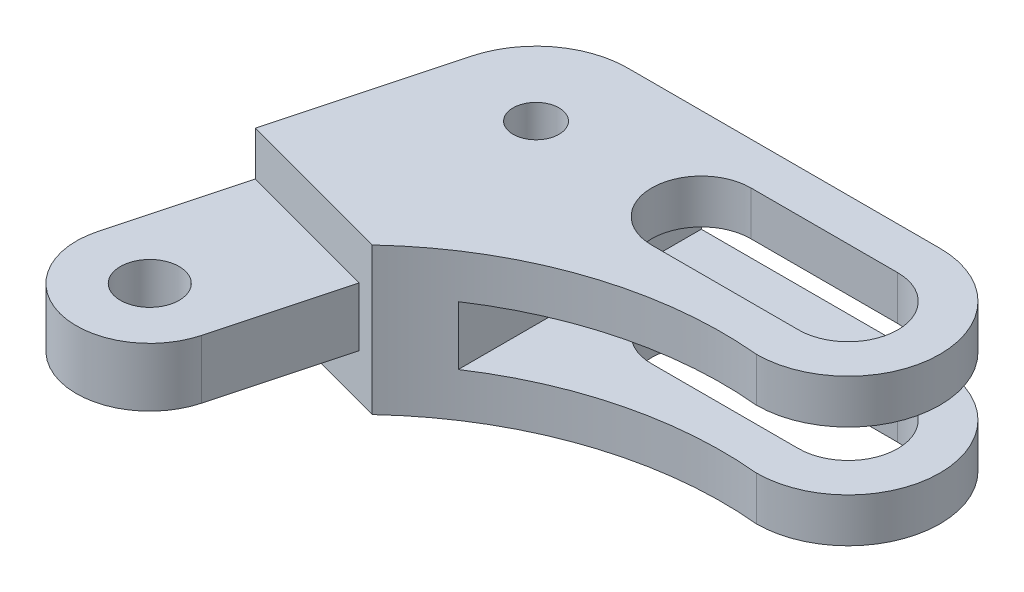
ISO-10303-21;
HEADER;
FILE_DESCRIPTION(('STEP AP214'),'2;1');
FILE_NAME('part.step','',(''),(''),'','','');
FILE_SCHEMA(('AUTOMOTIVE_DESIGN { 1 0 10303 214 1 1 1 1 }'));
ENDSEC;
DATA;
#1=APPLICATION_CONTEXT('core data for automotive mechanical design processes');
#2=APPLICATION_PROTOCOL_DEFINITION('international standard','automotive_design',2000,#1);
#3=PRODUCT_CONTEXT('',#1,'mechanical');
#4=PRODUCT('Part','Part','',(#3));
#5=PRODUCT_RELATED_PRODUCT_CATEGORY('part','',(#4));
#6=PRODUCT_DEFINITION_FORMATION('','',#4);
#7=PRODUCT_DEFINITION_CONTEXT('part definition',#1,'design');
#8=PRODUCT_DEFINITION('design','',#6,#7);
#9=PRODUCT_DEFINITION_SHAPE('','',#8);
#10=(LENGTH_UNIT() NAMED_UNIT(*) SI_UNIT(.MILLI.,.METRE.));
#11=(NAMED_UNIT(*) PLANE_ANGLE_UNIT() SI_UNIT($,.RADIAN.));
#12=(NAMED_UNIT(*) SI_UNIT($,.STERADIAN.) SOLID_ANGLE_UNIT());
#13=UNCERTAINTY_MEASURE_WITH_UNIT(LENGTH_MEASURE(1.E-05),#10,'distance_accuracy_value','');
#14=(GEOMETRIC_REPRESENTATION_CONTEXT(3) GLOBAL_UNCERTAINTY_ASSIGNED_CONTEXT((#13)) GLOBAL_UNIT_ASSIGNED_CONTEXT((#10,
#11,#12)) REPRESENTATION_CONTEXT('',''));
#15=CARTESIAN_POINT('',(0.,0.,0.));
#16=DIRECTION('',(0.,0.,1.));
#17=DIRECTION('',(1.,0.,0.));
#18=AXIS2_PLACEMENT_3D('',#15,#16,#17);
#19=CARTESIAN_POINT('',(224.877356199071,-28.,59.6900004852365));
#20=DIRECTION('',(0.,-1.,0.));
#21=DIRECTION('',(0.,0.,-1.));
#22=AXIS2_PLACEMENT_3D('',#19,#20,#21);
#23=PLANE('',#22);
#24=DIRECTION('',(0.,0.,-1.));
#25=VECTOR('',#24,1.);
#26=CARTESIAN_POINT('',(187.083853502132,-28.,97.4828239634885));
#27=LINE('',#26,#25);
#28=CARTESIAN_POINT('',(187.083853502132,-28.,97.4828239634885));
#29=VERTEX_POINT('',#28);
#30=CARTESIAN_POINT('',(187.083853502132,-28.,31.3048049703411));
#31=VERTEX_POINT('',#30);
#32=EDGE_CURVE('E163',#29,#31,#27,.T.);
#33=ORIENTED_EDGE('',*,*,#32,.F.);
#34=CARTESIAN_POINT('',(242.341419027115,-28.,180.829098338845));
#35=DIRECTION('',(0.,1.,0.));
#36=DIRECTION('',(0.0974243447501531,0.,-0.995242933685039));
#37=AXIS2_PLACEMENT_3D('',#34,#35,#36);
#38=CIRCLE('',#37,100.);
#39=CARTESIAN_POINT('',(252.083853502131,-28.,81.304804970341));
#40=VERTEX_POINT('',#39);
#41=EDGE_CURVE('E160',#40,#29,#38,.T.);
#42=ORIENTED_EDGE('',*,*,#41,.F.);
#43=CARTESIAN_POINT('',(252.083853502131,-28.,56.3048049703411));
#44=DIRECTION('',(0.,-1.,0.));
#45=DIRECTION('',(0.,0.,-1.));
#46=AXIS2_PLACEMENT_3D('',#43,#44,#45);
#47=CIRCLE('',#46,25.);
#48=CARTESIAN_POINT('',(252.083853502132,-28.,31.3048049703411));
#49=VERTEX_POINT('',#48);
#50=EDGE_CURVE('E145',#49,#40,#47,.T.);
#51=ORIENTED_EDGE('',*,*,#50,.F.);
#52=DIRECTION('',(1.,0.,0.));
#53=VECTOR('',#52,1.);
#54=CARTESIAN_POINT('',(187.083853502132,-28.,31.3048049703411));
#55=LINE('',#54,#53);
#56=EDGE_CURVE('E24',#31,#49,#55,.T.);
#57=ORIENTED_EDGE('',*,*,#56,.F.);
#58=EDGE_LOOP('',(#33,#42,#51,#57));
#59=FACE_BOUND('',#58,.T.);
#60=DIRECTION('',(1.,0.,0.));
#61=VECTOR('',#60,1.);
#62=CARTESIAN_POINT('',(212.083853502132,-28.,69.8048049703412));
#63=LINE('',#62,#61);
#64=CARTESIAN_POINT('',(212.083853502132,-28.,69.8048049703412));
#65=VERTEX_POINT('',#64);
#66=CARTESIAN_POINT('',(252.083853502132,-28.,69.8048049703412));
#67=VERTEX_POINT('',#66);
#68=EDGE_CURVE('E169',#65,#67,#63,.T.);
#69=ORIENTED_EDGE('',*,*,#68,.F.);
#70=CARTESIAN_POINT('',(212.083853502132,-28.,56.3048049703412));
#71=DIRECTION('',(0.,1.,0.));
#72=DIRECTION('',(0.,0.,-1.));
#73=AXIS2_PLACEMENT_3D('',#70,#71,#72);
#74=CIRCLE('',#73,13.5);
#75=CARTESIAN_POINT('',(212.083853502132,-28.,42.8048049703412));
#76=VERTEX_POINT('',#75);
#77=EDGE_CURVE('E176',#76,#65,#74,.T.);
#78=ORIENTED_EDGE('',*,*,#77,.F.);
#79=DIRECTION('',(-1.,0.,0.));
#80=VECTOR('',#79,1.);
#81=CARTESIAN_POINT('',(252.083853502132,-28.,42.8048049703412));
#82=LINE('',#81,#80);
#83=CARTESIAN_POINT('',(252.083853502132,-28.,42.8048049703412));
#84=VERTEX_POINT('',#83);
#85=EDGE_CURVE('E190',#84,#76,#82,.T.);
#86=ORIENTED_EDGE('',*,*,#85,.F.);
#87=CARTESIAN_POINT('',(252.083853502132,-28.,56.3048049703412));
#88=DIRECTION('',(0.,1.,0.));
#89=DIRECTION('',(0.,0.,1.));
#90=AXIS2_PLACEMENT_3D('',#87,#88,#89);
#91=CIRCLE('',#90,13.5);
#92=EDGE_CURVE('E192',#67,#84,#91,.T.);
#93=ORIENTED_EDGE('',*,*,#92,.F.);
#94=EDGE_LOOP('',(#69,#78,#86,#93));
#95=FACE_BOUND('',#94,.T.);
#96=ADVANCED_FACE('F15',(#59,#95),#23,.F.);
#97=CARTESIAN_POINT('',(224.877356199071,-40.,59.6900004852365));
#98=DIRECTION('',(0.,-1.,0.));
#99=DIRECTION('',(0.,0.,-1.));
#100=AXIS2_PLACEMENT_3D('',#97,#98,#99);
#101=PLANE('',#100);
#102=DIRECTION('',(1.,0.,0.));
#103=VECTOR('',#102,1.);
#104=CARTESIAN_POINT('',(167.083853502132,-40.,31.3048049703411));
#105=LINE('',#104,#103);
#106=CARTESIAN_POINT('',(167.083853502132,-40.,31.3048049703411));
#107=VERTEX_POINT('',#106);
#108=CARTESIAN_POINT('',(252.083853502132,-40.,31.3048049703411));
#109=VERTEX_POINT('',#108);
#110=EDGE_CURVE('E9',#107,#109,#105,.T.);
#111=ORIENTED_EDGE('',*,*,#110,.T.);
#112=CARTESIAN_POINT('',(252.083853502131,-40.,56.3048049703411));
#113=DIRECTION('',(0.,-1.,0.));
#114=DIRECTION('',(0.,0.,-1.));
#115=AXIS2_PLACEMENT_3D('',#112,#113,#114);
#116=CIRCLE('',#115,25.);
#117=CARTESIAN_POINT('',(252.083853502131,-40.,81.304804970341));
#118=VERTEX_POINT('',#117);
#119=EDGE_CURVE('E153',#109,#118,#116,.T.);
#120=ORIENTED_EDGE('',*,*,#119,.T.);
#121=CARTESIAN_POINT('',(242.341419027115,-40.,180.829098338845));
#122=DIRECTION('',(0.,1.,0.));
#123=DIRECTION('',(0.0974243447501531,0.,-0.995242933685039));
#124=AXIS2_PLACEMENT_3D('',#121,#122,#123);
#125=CIRCLE('',#124,100.);
#126=CARTESIAN_POINT('',(173.979055862993,-40.,107.845625534267));
#127=VERTEX_POINT('',#126);
#128=EDGE_CURVE('E159',#118,#127,#125,.T.);
#129=ORIENTED_EDGE('',*,*,#128,.T.);
#130=DIRECTION('',(-0.965925826289068,0.,-0.258819045102521));
#131=VECTOR('',#130,1.);
#132=CARTESIAN_POINT('',(173.979055862993,-40.,107.845625534267));
#133=LINE('',#132,#131);
#134=CARTESIAN_POINT('',(130.512393679984,-40.,96.1987685046534));
#135=VERTEX_POINT('',#134);
#136=EDGE_CURVE('E256',#127,#135,#133,.T.);
#137=ORIENTED_EDGE('',*,*,#136,.T.);
#138=DIRECTION('',(0.258819045102521,0.,-0.965925826289068));
#139=VECTOR('',#138,1.);
#140=CARTESIAN_POINT('',(130.512393679984,-40.,96.1987685046534));
#141=LINE('',#140,#139);
#142=CARTESIAN_POINT('',(142.935707844905,-40.,49.8343288427781));
#143=VERTEX_POINT('',#142);
#144=EDGE_CURVE('E330',#135,#143,#141,.T.);
#145=ORIENTED_EDGE('',*,*,#144,.T.);
#146=CARTESIAN_POINT('',(167.083853502132,-40.,56.3048049703412));
#147=DIRECTION('',(0.,-1.,0.));
#148=DIRECTION('',(-0.965925826289068,0.,-0.258819045102521));
#149=AXIS2_PLACEMENT_3D('',#146,#147,#148);
#150=CIRCLE('',#149,25.);
#151=EDGE_CURVE('E321',#143,#107,#150,.T.);
#152=ORIENTED_EDGE('',*,*,#151,.T.);
#153=EDGE_LOOP('',(#111,#120,#129,#137,#145,#152));
#154=FACE_BOUND('',#153,.T.);
#155=DIRECTION('',(1.,0.,0.));
#156=VECTOR('',#155,1.);
#157=CARTESIAN_POINT('',(212.083853502132,-40.,69.8048049703412));
#158=LINE('',#157,#156);
#159=CARTESIAN_POINT('',(212.083853502132,-40.,69.8048049703412));
#160=VERTEX_POINT('',#159);
#161=CARTESIAN_POINT('',(252.083853502132,-40.,69.8048049703412));
#162=VERTEX_POINT('',#161);
#163=EDGE_CURVE('E140',#160,#162,#158,.T.);
#164=ORIENTED_EDGE('',*,*,#163,.T.);
#165=CARTESIAN_POINT('',(252.083853502132,-40.,56.3048049703412));
#166=DIRECTION('',(0.,1.,0.));
#167=DIRECTION('',(0.,0.,1.));
#168=AXIS2_PLACEMENT_3D('',#165,#166,#167);
#169=CIRCLE('',#168,13.5);
#170=CARTESIAN_POINT('',(252.083853502132,-40.,42.8048049703412));
#171=VERTEX_POINT('',#170);
#172=EDGE_CURVE('E198',#162,#171,#169,.T.);
#173=ORIENTED_EDGE('',*,*,#172,.T.);
#174=DIRECTION('',(-1.,0.,0.));
#175=VECTOR('',#174,1.);
#176=CARTESIAN_POINT('',(252.083853502132,-40.,42.8048049703412));
#177=LINE('',#176,#175);
#178=CARTESIAN_POINT('',(212.083853502132,-40.,42.8048049703412));
#179=VERTEX_POINT('',#178);
#180=EDGE_CURVE('E188',#171,#179,#177,.T.);
#181=ORIENTED_EDGE('',*,*,#180,.T.);
#182=CARTESIAN_POINT('',(212.083853502132,-40.,56.3048049703412));
#183=DIRECTION('',(0.,1.,0.));
#184=DIRECTION('',(0.,0.,-1.));
#185=AXIS2_PLACEMENT_3D('',#182,#183,#184);
#186=CIRCLE('',#185,13.5);
#187=EDGE_CURVE('E181',#179,#160,#186,.T.);
#188=ORIENTED_EDGE('',*,*,#187,.T.);
#189=EDGE_LOOP('',(#164,#173,#181,#188));
#190=FACE_BOUND('',#189,.T.);
#191=CARTESIAN_POINT('',(167.083853502132,-40.,56.3048049703412));
#192=DIRECTION('',(0.,1.,0.));
#193=DIRECTION('',(1.,0.,0.));
#194=AXIS2_PLACEMENT_3D('',#191,#192,#193);
#195=CIRCLE('',#194,6.25);
#196=CARTESIAN_POINT('',(160.833853502132,-40.,56.3048049703412));
#197=VERTEX_POINT('',#196);
#198=EDGE_CURVE('E250',#197,#197,#195,.T.);
#199=ORIENTED_EDGE('',*,*,#198,.T.);
#200=EDGE_LOOP('',(#199));
#201=FACE_BOUND('',#200,.T.);
#202=ADVANCED_FACE('F345',(#154,#190,#201),#101,.T.);
#203=CARTESIAN_POINT('',(187.083853502132,-28.,31.3048049703411));
#204=DIRECTION('',(0.,0.,-1.));
#205=DIRECTION('',(1.,0.,0.));
#206=AXIS2_PLACEMENT_3D('',#203,#204,#205);
#207=PLANE('',#206);
#208=ORIENTED_EDGE('',*,*,#56,.T.);
#209=DIRECTION('',(0.,-1.,0.));
#210=VECTOR('',#209,1.);
#211=CARTESIAN_POINT('',(252.083853502132,-28.,31.3048049703411));
#212=LINE('',#211,#210);
#213=EDGE_CURVE('E18',#49,#109,#212,.T.);
#214=ORIENTED_EDGE('',*,*,#213,.T.);
#215=ORIENTED_EDGE('',*,*,#110,.F.);
#216=DIRECTION('',(0.,-1.,0.));
#217=VECTOR('',#216,1.);
#218=CARTESIAN_POINT('',(167.083853502132,0.,31.3048049703411));
#219=LINE('',#218,#217);
#220=CARTESIAN_POINT('',(167.083853502132,0.,31.3048049703411));
#221=VERTEX_POINT('',#220);
#222=EDGE_CURVE('E318',#221,#107,#219,.T.);
#223=ORIENTED_EDGE('',*,*,#222,.F.);
#224=DIRECTION('',(1.,0.,0.));
#225=VECTOR('',#224,1.);
#226=CARTESIAN_POINT('',(167.083853502132,0.,31.3048049703411));
#227=LINE('',#226,#225);
#228=CARTESIAN_POINT('',(252.083853502132,0.,31.3048049703411));
#229=VERTEX_POINT('',#228);
#230=EDGE_CURVE('E173',#221,#229,#227,.T.);
#231=ORIENTED_EDGE('',*,*,#230,.T.);
#232=DIRECTION('',(0.,-1.,0.));
#233=VECTOR('',#232,1.);
#234=CARTESIAN_POINT('',(252.083853502132,0.,31.3048049703411));
#235=LINE('',#234,#233);
#236=CARTESIAN_POINT('',(252.083853502132,-12.,31.3048049703411));
#237=VERTEX_POINT('',#236);
#238=EDGE_CURVE('E230',#229,#237,#235,.T.);
#239=ORIENTED_EDGE('',*,*,#238,.T.);
#240=DIRECTION('',(1.,0.,0.));
#241=VECTOR('',#240,1.);
#242=CARTESIAN_POINT('',(187.083853502132,-12.,31.3048049703411));
#243=LINE('',#242,#241);
#244=CARTESIAN_POINT('',(187.083853502132,-12.,31.3048049703411));
#245=VERTEX_POINT('',#244);
#246=EDGE_CURVE('E306',#245,#237,#243,.T.);
#247=ORIENTED_EDGE('',*,*,#246,.F.);
#248=DIRECTION('',(0.,-1.,0.));
#249=VECTOR('',#248,1.);
#250=CARTESIAN_POINT('',(187.083853502132,0.,31.3048049703411));
#251=LINE('',#250,#249);
#252=EDGE_CURVE('E221',#245,#31,#251,.T.);
#253=ORIENTED_EDGE('',*,*,#252,.T.);
#254=EDGE_LOOP('',(#208,#214,#215,#223,#231,#239,#247,#253));
#255=FACE_BOUND('',#254,.T.);
#256=ADVANCED_FACE('F342',(#255),#207,.T.);
#257=CARTESIAN_POINT('',(252.083853502131,-28.,56.3048049703411));
#258=DIRECTION('',(0.,1.,0.));
#259=DIRECTION('',(0.,0.,-1.));
#260=AXIS2_PLACEMENT_3D('',#257,#258,#259);
#261=CYLINDRICAL_SURFACE('',#260,25.);
#262=ORIENTED_EDGE('',*,*,#50,.T.);
#263=DIRECTION('',(0.,-1.,0.));
#264=VECTOR('',#263,1.);
#265=CARTESIAN_POINT('',(252.083853502131,-28.,81.304804970341));
#266=LINE('',#265,#264);
#267=EDGE_CURVE('E146',#40,#118,#266,.T.);
#268=ORIENTED_EDGE('',*,*,#267,.T.);
#269=ORIENTED_EDGE('',*,*,#119,.F.);
#270=ORIENTED_EDGE('',*,*,#213,.F.);
#271=EDGE_LOOP('',(#262,#268,#269,#270));
#272=FACE_BOUND('',#271,.T.);
#273=ADVANCED_FACE('F148',(#272),#261,.T.);
#274=CARTESIAN_POINT('',(242.341419027115,-28.,180.829098338845));
#275=DIRECTION('',(0.,1.,0.));
#276=DIRECTION('',(0.0974243447501531,0.,-0.995242933685039));
#277=AXIS2_PLACEMENT_3D('',#274,#275,#276);
#278=CYLINDRICAL_SURFACE('',#277,100.);
#279=ORIENTED_EDGE('',*,*,#41,.T.);
#280=DIRECTION('',(0.,-1.,0.));
#281=VECTOR('',#280,1.);
#282=CARTESIAN_POINT('',(187.083853502132,0.,97.4828239634884));
#283=LINE('',#282,#281);
#284=CARTESIAN_POINT('',(187.083853502132,-12.,97.4828239634884));
#285=VERTEX_POINT('',#284);
#286=EDGE_CURVE('E223',#285,#29,#283,.T.);
#287=ORIENTED_EDGE('',*,*,#286,.F.);
#288=CARTESIAN_POINT('',(242.341419027115,-12.,180.829098338845));
#289=DIRECTION('',(0.,1.,0.));
#290=DIRECTION('',(0.0974243447501531,0.,-0.995242933685039));
#291=AXIS2_PLACEMENT_3D('',#288,#289,#290);
#292=CIRCLE('',#291,100.);
#293=CARTESIAN_POINT('',(252.083853502131,-12.,81.3048049703409));
#294=VERTEX_POINT('',#293);
#295=EDGE_CURVE('E309',#294,#285,#292,.T.);
#296=ORIENTED_EDGE('',*,*,#295,.F.);
#297=DIRECTION('',(0.,-1.,0.));
#298=VECTOR('',#297,1.);
#299=CARTESIAN_POINT('',(252.083853502131,0.,81.3048049703409));
#300=LINE('',#299,#298);
#301=CARTESIAN_POINT('',(252.083853502131,0.,81.3048049703409));
#302=VERTEX_POINT('',#301);
#303=EDGE_CURVE('E303',#302,#294,#300,.T.);
#304=ORIENTED_EDGE('',*,*,#303,.F.);
#305=CARTESIAN_POINT('',(242.341419027115,0.,180.829098338845));
#306=DIRECTION('',(0.,1.,0.));
#307=DIRECTION('',(0.0974243447501531,0.,-0.995242933685039));
#308=AXIS2_PLACEMENT_3D('',#305,#306,#307);
#309=CIRCLE('',#308,100.);
#310=CARTESIAN_POINT('',(173.979055862993,0.,107.845625534267));
#311=VERTEX_POINT('',#310);
#312=EDGE_CURVE('E172',#302,#311,#309,.T.);
#313=ORIENTED_EDGE('',*,*,#312,.T.);
#314=DIRECTION('',(0.,-1.,0.));
#315=VECTOR('',#314,1.);
#316=CARTESIAN_POINT('',(173.979055862993,0.,107.845625534267));
#317=LINE('',#316,#315);
#318=EDGE_CURVE('E261',#311,#127,#317,.T.);
#319=ORIENTED_EDGE('',*,*,#318,.T.);
#320=ORIENTED_EDGE('',*,*,#128,.F.);
#321=ORIENTED_EDGE('',*,*,#267,.F.);
#322=EDGE_LOOP('',(#279,#287,#296,#304,#313,#319,#320,#321));
#323=FACE_BOUND('',#322,.T.);
#324=ADVANCED_FACE('F156',(#323),#278,.F.);
#325=CARTESIAN_POINT('',(212.083853502132,-28.,69.8048049703412));
#326=DIRECTION('',(0.,0.,-1.));
#327=DIRECTION('',(1.,0.,0.));
#328=AXIS2_PLACEMENT_3D('',#325,#326,#327);
#329=PLANE('',#328);
#330=ORIENTED_EDGE('',*,*,#68,.T.);
#331=DIRECTION('',(0.,-1.,0.));
#332=VECTOR('',#331,1.);
#333=CARTESIAN_POINT('',(252.083853502132,-28.,69.8048049703412));
#334=LINE('',#333,#332);
#335=EDGE_CURVE('E197',#67,#162,#334,.T.);
#336=ORIENTED_EDGE('',*,*,#335,.T.);
#337=ORIENTED_EDGE('',*,*,#163,.F.);
#338=DIRECTION('',(0.,-1.,0.));
#339=VECTOR('',#338,1.);
#340=CARTESIAN_POINT('',(212.083853502132,-28.,69.8048049703412));
#341=LINE('',#340,#339);
#342=EDGE_CURVE('E177',#65,#160,#341,.T.);
#343=ORIENTED_EDGE('',*,*,#342,.F.);
#344=EDGE_LOOP('',(#330,#336,#337,#343));
#345=FACE_BOUND('',#344,.T.);
#346=ADVANCED_FACE('F395',(#345),#329,.T.);
#347=CARTESIAN_POINT('',(252.083853502132,-28.,56.3048049703412));
#348=DIRECTION('',(0.,1.,0.));
#349=DIRECTION('',(0.,0.,1.));
#350=AXIS2_PLACEMENT_3D('',#347,#348,#349);
#351=CYLINDRICAL_SURFACE('',#350,13.5);
#352=ORIENTED_EDGE('',*,*,#92,.T.);
#353=DIRECTION('',(0.,-1.,0.));
#354=VECTOR('',#353,1.);
#355=CARTESIAN_POINT('',(252.083853502132,-28.,42.8048049703412));
#356=LINE('',#355,#354);
#357=EDGE_CURVE('E191',#84,#171,#356,.T.);
#358=ORIENTED_EDGE('',*,*,#357,.T.);
#359=ORIENTED_EDGE('',*,*,#172,.F.);
#360=ORIENTED_EDGE('',*,*,#335,.F.);
#361=EDGE_LOOP('',(#352,#358,#359,#360));
#362=FACE_BOUND('',#361,.T.);
#363=ADVANCED_FACE('F401',(#362),#351,.F.);
#364=CARTESIAN_POINT('',(252.083853502132,-28.,42.8048049703412));
#365=DIRECTION('',(0.,0.,1.));
#366=DIRECTION('',(-1.,0.,0.));
#367=AXIS2_PLACEMENT_3D('',#364,#365,#366);
#368=PLANE('',#367);
#369=ORIENTED_EDGE('',*,*,#85,.T.);
#370=DIRECTION('',(0.,-1.,0.));
#371=VECTOR('',#370,1.);
#372=CARTESIAN_POINT('',(212.083853502132,-28.,42.8048049703412));
#373=LINE('',#372,#371);
#374=EDGE_CURVE('E182',#76,#179,#373,.T.);
#375=ORIENTED_EDGE('',*,*,#374,.T.);
#376=ORIENTED_EDGE('',*,*,#180,.F.);
#377=ORIENTED_EDGE('',*,*,#357,.F.);
#378=EDGE_LOOP('',(#369,#375,#376,#377));
#379=FACE_BOUND('',#378,.T.);
#380=ADVANCED_FACE('F409',(#379),#368,.T.);
#381=CARTESIAN_POINT('',(212.083853502132,-28.,56.3048049703412));
#382=DIRECTION('',(0.,1.,0.));
#383=DIRECTION('',(0.,0.,-1.));
#384=AXIS2_PLACEMENT_3D('',#381,#382,#383);
#385=CYLINDRICAL_SURFACE('',#384,13.5);
#386=ORIENTED_EDGE('',*,*,#77,.T.);
#387=ORIENTED_EDGE('',*,*,#342,.T.);
#388=ORIENTED_EDGE('',*,*,#187,.F.);
#389=ORIENTED_EDGE('',*,*,#374,.F.);
#390=EDGE_LOOP('',(#386,#387,#388,#389));
#391=FACE_BOUND('',#390,.T.);
#392=ADVANCED_FACE('F416',(#391),#385,.F.);
#393=CARTESIAN_POINT('',(163.431153252462,0.,69.7439758114962));
#394=DIRECTION('',(0.,-1.,0.));
#395=DIRECTION('',(0.,0.,-1.));
#396=AXIS2_PLACEMENT_3D('',#393,#394,#395);
#397=PLANE('',#396);
#398=DIRECTION('',(0.258819045102521,0.,-0.965925826289068));
#399=VECTOR('',#398,1.);
#400=CARTESIAN_POINT('',(130.512393679984,0.,96.1987685046534));
#401=LINE('',#400,#399);
#402=CARTESIAN_POINT('',(130.512393679984,0.,96.1987685046534));
#403=VERTEX_POINT('',#402);
#404=CARTESIAN_POINT('',(142.935707844905,0.,49.8343288427781));
#405=VERTEX_POINT('',#404);
#406=EDGE_CURVE('E326',#403,#405,#401,.T.);
#407=ORIENTED_EDGE('',*,*,#406,.F.);
#408=DIRECTION('',(-0.965925826289068,0.,-0.258819045102521));
#409=VECTOR('',#408,1.);
#410=CARTESIAN_POINT('',(173.979055862993,0.,107.845625534267));
#411=LINE('',#410,#409);
#412=EDGE_CURVE('E263',#311,#403,#411,.T.);
#413=ORIENTED_EDGE('',*,*,#412,.F.);
#414=ORIENTED_EDGE('',*,*,#312,.F.);
#415=CARTESIAN_POINT('',(252.083853502131,0.,56.304804970341));
#416=DIRECTION('',(0.,-1.,0.));
#417=DIRECTION('',(0.,0.,-1.));
#418=AXIS2_PLACEMENT_3D('',#415,#416,#417);
#419=CIRCLE('',#418,25.);
#420=EDGE_CURVE('E299',#229,#302,#419,.T.);
#421=ORIENTED_EDGE('',*,*,#420,.F.);
#422=ORIENTED_EDGE('',*,*,#230,.F.);
#423=CARTESIAN_POINT('',(167.083853502132,0.,56.3048049703412));
#424=DIRECTION('',(0.,-1.,0.));
#425=DIRECTION('',(-0.965925826289068,0.,-0.258819045102521));
#426=AXIS2_PLACEMENT_3D('',#423,#424,#425);
#427=CIRCLE('',#426,25.);
#428=EDGE_CURVE('E252',#405,#221,#427,.T.);
#429=ORIENTED_EDGE('',*,*,#428,.F.);
#430=EDGE_LOOP('',(#407,#413,#414,#421,#422,#429));
#431=FACE_BOUND('',#430,.T.);
#432=CARTESIAN_POINT('',(167.083853502132,0.,56.3048049703412));
#433=DIRECTION('',(0.,1.,0.));
#434=DIRECTION('',(1.,0.,0.));
#435=AXIS2_PLACEMENT_3D('',#432,#433,#434);
#436=CIRCLE('',#435,6.25);
#437=CARTESIAN_POINT('',(160.833853502132,0.,56.3048049703412));
#438=VERTEX_POINT('',#437);
#439=EDGE_CURVE('E249',#438,#438,#436,.T.);
#440=ORIENTED_EDGE('',*,*,#439,.F.);
#441=EDGE_LOOP('',(#440));
#442=FACE_BOUND('',#441,.T.);
#443=DIRECTION('',(1.,0.,0.));
#444=VECTOR('',#443,1.);
#445=CARTESIAN_POINT('',(212.083853502132,0.,69.8048049703411));
#446=LINE('',#445,#444);
#447=CARTESIAN_POINT('',(212.083853502132,0.,69.8048049703411));
#448=VERTEX_POINT('',#447);
#449=CARTESIAN_POINT('',(252.083853502132,0.,69.8048049703411));
#450=VERTEX_POINT('',#449);
#451=EDGE_CURVE('E294',#448,#450,#446,.T.);
#452=ORIENTED_EDGE('',*,*,#451,.F.);
#453=CARTESIAN_POINT('',(212.083853502132,0.,56.3048049703411));
#454=DIRECTION('',(0.,1.,0.));
#455=DIRECTION('',(0.,0.,-1.));
#456=AXIS2_PLACEMENT_3D('',#453,#454,#455);
#457=CIRCLE('',#456,13.5);
#458=CARTESIAN_POINT('',(212.083853502132,0.,42.8048049703412));
#459=VERTEX_POINT('',#458);
#460=EDGE_CURVE('E267',#459,#448,#457,.T.);
#461=ORIENTED_EDGE('',*,*,#460,.F.);
#462=DIRECTION('',(-1.,0.,0.));
#463=VECTOR('',#462,1.);
#464=CARTESIAN_POINT('',(252.083853502132,0.,42.8048049703412));
#465=LINE('',#464,#463);
#466=CARTESIAN_POINT('',(252.083853502132,0.,42.8048049703412));
#467=VERTEX_POINT('',#466);
#468=EDGE_CURVE('E281',#467,#459,#465,.T.);
#469=ORIENTED_EDGE('',*,*,#468,.F.);
#470=CARTESIAN_POINT('',(252.083853502132,0.,56.3048049703411));
#471=DIRECTION('',(0.,1.,0.));
#472=DIRECTION('',(0.,0.,1.));
#473=AXIS2_PLACEMENT_3D('',#470,#471,#472);
#474=CIRCLE('',#473,13.5);
#475=EDGE_CURVE('E288',#450,#467,#474,.T.);
#476=ORIENTED_EDGE('',*,*,#475,.F.);
#477=EDGE_LOOP('',(#452,#461,#469,#476));
#478=FACE_BOUND('',#477,.T.);
#479=ADVANCED_FACE('F333',(#431,#442,#478),#397,.F.);
#480=CARTESIAN_POINT('',(130.512393679984,0.,96.1987685046534));
#481=DIRECTION('',(-0.965925826289068,0.,-0.258819045102521));
#482=DIRECTION('',(0.258819045102521,0.,-0.965925826289068));
#483=AXIS2_PLACEMENT_3D('',#480,#481,#482);
#484=PLANE('',#483);
#485=ORIENTED_EDGE('',*,*,#406,.T.);
#486=DIRECTION('',(0.,-1.,0.));
#487=VECTOR('',#486,1.);
#488=CARTESIAN_POINT('',(142.935707844905,0.,49.8343288427781));
#489=LINE('',#488,#487);
#490=EDGE_CURVE('E323',#405,#143,#489,.T.);
#491=ORIENTED_EDGE('',*,*,#490,.T.);
#492=ORIENTED_EDGE('',*,*,#144,.F.);
#493=DIRECTION('',(0.,-1.,0.));
#494=VECTOR('',#493,1.);
#495=CARTESIAN_POINT('',(130.512393679984,0.,96.1987685046534));
#496=LINE('',#495,#494);
#497=CARTESIAN_POINT('',(130.512393679984,-28.,96.1987685046534));
#498=VERTEX_POINT('',#497);
#499=EDGE_CURVE('E254',#498,#135,#496,.T.);
#500=ORIENTED_EDGE('',*,*,#499,.F.);
#501=DIRECTION('',(0.25881904510252,0.,-0.965925826289068));
#502=VECTOR('',#501,1.);
#503=CARTESIAN_POINT('',(121.453727101396,-28.,130.006172424771));
#504=LINE('',#503,#502);
#505=CARTESIAN_POINT('',(121.453727101396,-28.,130.006172424771));
#506=VERTEX_POINT('',#505);
#507=EDGE_CURVE('E217',#506,#498,#504,.T.);
#508=ORIENTED_EDGE('',*,*,#507,.F.);
#509=DIRECTION('',(0.,-1.,0.));
#510=VECTOR('',#509,1.);
#511=CARTESIAN_POINT('',(121.453727101396,-12.,130.006172424771));
#512=LINE('',#511,#510);
#513=CARTESIAN_POINT('',(121.453727101396,-12.,130.006172424771));
#514=VERTEX_POINT('',#513);
#515=EDGE_CURVE('E218',#514,#506,#512,.T.);
#516=ORIENTED_EDGE('',*,*,#515,.F.);
#517=DIRECTION('',(0.25881904510252,0.,-0.965925826289068));
#518=VECTOR('',#517,1.);
#519=CARTESIAN_POINT('',(121.453727101396,-12.,130.006172424771));
#520=LINE('',#519,#518);
#521=CARTESIAN_POINT('',(130.512393679984,-12.,96.1987685046534));
#522=VERTEX_POINT('',#521);
#523=EDGE_CURVE('E215',#514,#522,#520,.T.);
#524=ORIENTED_EDGE('',*,*,#523,.T.);
#525=DIRECTION('',(0.,-1.,0.));
#526=VECTOR('',#525,1.);
#527=CARTESIAN_POINT('',(130.512393679984,0.,96.1987685046534));
#528=LINE('',#527,#526);
#529=EDGE_CURVE('E266',#403,#522,#528,.T.);
#530=ORIENTED_EDGE('',*,*,#529,.F.);
#531=EDGE_LOOP('',(#485,#491,#492,#500,#508,#516,#524,#530));
#532=FACE_BOUND('',#531,.T.);
#533=ADVANCED_FACE('F362',(#532),#484,.T.);
#534=CARTESIAN_POINT('',(167.083853502132,0.,56.3048049703412));
#535=DIRECTION('',(0.,1.,0.));
#536=DIRECTION('',(-0.965925826289068,0.,-0.258819045102521));
#537=AXIS2_PLACEMENT_3D('',#534,#535,#536);
#538=CYLINDRICAL_SURFACE('',#537,25.);
#539=ORIENTED_EDGE('',*,*,#428,.T.);
#540=ORIENTED_EDGE('',*,*,#222,.T.);
#541=ORIENTED_EDGE('',*,*,#151,.F.);
#542=ORIENTED_EDGE('',*,*,#490,.F.);
#543=EDGE_LOOP('',(#539,#540,#541,#542));
#544=FACE_BOUND('',#543,.T.);
#545=ADVANCED_FACE('F351',(#544),#538,.T.);
#546=CARTESIAN_POINT('',(167.083853502132,0.,56.3048049703412));
#547=DIRECTION('',(0.,1.,0.));
#548=DIRECTION('',(1.,0.,0.));
#549=AXIS2_PLACEMENT_3D('',#546,#547,#548);
#550=CYLINDRICAL_SURFACE('',#549,6.25);
#551=ORIENTED_EDGE('',*,*,#439,.T.);
#552=EDGE_LOOP('',(#551));
#553=FACE_BOUND('',#552,.T.);
#554=ORIENTED_EDGE('',*,*,#198,.F.);
#555=EDGE_LOOP('',(#554));
#556=FACE_BOUND('',#555,.T.);
#557=ADVANCED_FACE('F348',(#553,#556),#550,.F.);
#558=CARTESIAN_POINT('',(187.083853502132,0.,31.3048049703411));
#559=DIRECTION('',(1.,0.,0.));
#560=DIRECTION('',(0.,0.,1.));
#561=AXIS2_PLACEMENT_3D('',#558,#559,#560);
#562=PLANE('',#561);
#563=DIRECTION('',(0.,0.,1.));
#564=VECTOR('',#563,1.);
#565=CARTESIAN_POINT('',(187.083853502132,-12.,45.4974027277888));
#566=LINE('',#565,#564);
#567=EDGE_CURVE('E233',#245,#285,#566,.T.);
#568=ORIENTED_EDGE('',*,*,#567,.T.);
#569=ORIENTED_EDGE('',*,*,#286,.T.);
#570=ORIENTED_EDGE('',*,*,#32,.T.);
#571=ORIENTED_EDGE('',*,*,#252,.F.);
#572=EDGE_LOOP('',(#568,#569,#570,#571));
#573=FACE_BOUND('',#572,.T.);
#574=ADVANCED_FACE('F349',(#573),#562,.T.);
#575=CARTESIAN_POINT('',(224.877356199071,-12.,59.6900004852365));
#576=DIRECTION('',(0.,-1.,0.));
#577=DIRECTION('',(0.,0.,-1.));
#578=AXIS2_PLACEMENT_3D('',#575,#576,#577);
#579=PLANE('',#578);
#580=ORIENTED_EDGE('',*,*,#567,.F.);
#581=ORIENTED_EDGE('',*,*,#246,.T.);
#582=CARTESIAN_POINT('',(252.083853502131,-12.,56.304804970341));
#583=DIRECTION('',(0.,-1.,0.));
#584=DIRECTION('',(0.,0.,-1.));
#585=AXIS2_PLACEMENT_3D('',#582,#583,#584);
#586=CIRCLE('',#585,25.);
#587=EDGE_CURVE('E232',#237,#294,#586,.T.);
#588=ORIENTED_EDGE('',*,*,#587,.T.);
#589=ORIENTED_EDGE('',*,*,#295,.T.);
#590=EDGE_LOOP('',(#580,#581,#588,#589));
#591=FACE_BOUND('',#590,.T.);
#592=DIRECTION('',(1.,0.,0.));
#593=VECTOR('',#592,1.);
#594=CARTESIAN_POINT('',(212.083853502132,-12.,69.8048049703411));
#595=LINE('',#594,#593);
#596=CARTESIAN_POINT('',(212.083853502132,-12.,69.8048049703411));
#597=VERTEX_POINT('',#596);
#598=CARTESIAN_POINT('',(252.083853502132,-12.,69.8048049703411));
#599=VERTEX_POINT('',#598);
#600=EDGE_CURVE('E297',#597,#599,#595,.T.);
#601=ORIENTED_EDGE('',*,*,#600,.T.);
#602=CARTESIAN_POINT('',(252.083853502132,-12.,56.3048049703411));
#603=DIRECTION('',(0.,1.,0.));
#604=DIRECTION('',(0.,0.,1.));
#605=AXIS2_PLACEMENT_3D('',#602,#603,#604);
#606=CIRCLE('',#605,13.5);
#607=CARTESIAN_POINT('',(252.083853502132,-12.,42.8048049703412));
#608=VERTEX_POINT('',#607);
#609=EDGE_CURVE('E289',#599,#608,#606,.T.);
#610=ORIENTED_EDGE('',*,*,#609,.T.);
#611=DIRECTION('',(-1.,0.,0.));
#612=VECTOR('',#611,1.);
#613=CARTESIAN_POINT('',(252.083853502132,-12.,42.8048049703412));
#614=LINE('',#613,#612);
#615=CARTESIAN_POINT('',(212.083853502132,-12.,42.8048049703412));
#616=VERTEX_POINT('',#615);
#617=EDGE_CURVE('E284',#608,#616,#614,.T.);
#618=ORIENTED_EDGE('',*,*,#617,.T.);
#619=CARTESIAN_POINT('',(212.083853502132,-12.,56.3048049703411));
#620=DIRECTION('',(0.,1.,0.));
#621=DIRECTION('',(0.,0.,-1.));
#622=AXIS2_PLACEMENT_3D('',#619,#620,#621);
#623=CIRCLE('',#622,13.5);
#624=EDGE_CURVE('E274',#616,#597,#623,.T.);
#625=ORIENTED_EDGE('',*,*,#624,.T.);
#626=EDGE_LOOP('',(#601,#610,#618,#625));
#627=FACE_BOUND('',#626,.T.);
#628=ADVANCED_FACE('F357',(#591,#627),#579,.T.);
#629=CARTESIAN_POINT('',(252.083853502131,0.,56.304804970341));
#630=DIRECTION('',(0.,1.,0.));
#631=DIRECTION('',(0.,0.,-1.));
#632=AXIS2_PLACEMENT_3D('',#629,#630,#631);
#633=CYLINDRICAL_SURFACE('',#632,25.);
#634=ORIENTED_EDGE('',*,*,#420,.T.);
#635=ORIENTED_EDGE('',*,*,#303,.T.);
#636=ORIENTED_EDGE('',*,*,#587,.F.);
#637=ORIENTED_EDGE('',*,*,#238,.F.);
#638=EDGE_LOOP('',(#634,#635,#636,#637));
#639=FACE_BOUND('',#638,.T.);
#640=ADVANCED_FACE('F457',(#639),#633,.T.);
#641=CARTESIAN_POINT('',(212.083853502132,0.,69.8048049703411));
#642=DIRECTION('',(0.,0.,-1.));
#643=DIRECTION('',(1.,0.,0.));
#644=AXIS2_PLACEMENT_3D('',#641,#642,#643);
#645=PLANE('',#644);
#646=ORIENTED_EDGE('',*,*,#451,.T.);
#647=DIRECTION('',(0.,-1.,0.));
#648=VECTOR('',#647,1.);
#649=CARTESIAN_POINT('',(252.083853502132,0.,69.8048049703411));
#650=LINE('',#649,#648);
#651=EDGE_CURVE('E291',#450,#599,#650,.T.);
#652=ORIENTED_EDGE('',*,*,#651,.T.);
#653=ORIENTED_EDGE('',*,*,#600,.F.);
#654=DIRECTION('',(0.,-1.,0.));
#655=VECTOR('',#654,1.);
#656=CARTESIAN_POINT('',(212.083853502132,0.,69.8048049703411));
#657=LINE('',#656,#655);
#658=EDGE_CURVE('E275',#448,#597,#657,.T.);
#659=ORIENTED_EDGE('',*,*,#658,.F.);
#660=EDGE_LOOP('',(#646,#652,#653,#659));
#661=FACE_BOUND('',#660,.T.);
#662=ADVANCED_FACE('F470',(#661),#645,.T.);
#663=CARTESIAN_POINT('',(252.083853502132,0.,56.3048049703411));
#664=DIRECTION('',(0.,1.,0.));
#665=DIRECTION('',(0.,0.,1.));
#666=AXIS2_PLACEMENT_3D('',#663,#664,#665);
#667=CYLINDRICAL_SURFACE('',#666,13.5);
#668=ORIENTED_EDGE('',*,*,#475,.T.);
#669=DIRECTION('',(0.,-1.,0.));
#670=VECTOR('',#669,1.);
#671=CARTESIAN_POINT('',(252.083853502132,0.,42.8048049703412));
#672=LINE('',#671,#670);
#673=EDGE_CURVE('E285',#467,#608,#672,.T.);
#674=ORIENTED_EDGE('',*,*,#673,.T.);
#675=ORIENTED_EDGE('',*,*,#609,.F.);
#676=ORIENTED_EDGE('',*,*,#651,.F.);
#677=EDGE_LOOP('',(#668,#674,#675,#676));
#678=FACE_BOUND('',#677,.T.);
#679=ADVANCED_FACE('F474',(#678),#667,.F.);
#680=CARTESIAN_POINT('',(252.083853502132,0.,42.8048049703412));
#681=DIRECTION('',(0.,0.,1.));
#682=DIRECTION('',(-1.,0.,0.));
#683=AXIS2_PLACEMENT_3D('',#680,#681,#682);
#684=PLANE('',#683);
#685=ORIENTED_EDGE('',*,*,#468,.T.);
#686=DIRECTION('',(0.,-1.,0.));
#687=VECTOR('',#686,1.);
#688=CARTESIAN_POINT('',(212.083853502132,0.,42.8048049703412));
#689=LINE('',#688,#687);
#690=EDGE_CURVE('E279',#459,#616,#689,.T.);
#691=ORIENTED_EDGE('',*,*,#690,.T.);
#692=ORIENTED_EDGE('',*,*,#617,.F.);
#693=ORIENTED_EDGE('',*,*,#673,.F.);
#694=EDGE_LOOP('',(#685,#691,#692,#693));
#695=FACE_BOUND('',#694,.T.);
#696=ADVANCED_FACE('F483',(#695),#684,.T.);
#697=CARTESIAN_POINT('',(212.083853502132,0.,56.3048049703411));
#698=DIRECTION('',(0.,1.,0.));
#699=DIRECTION('',(0.,0.,-1.));
#700=AXIS2_PLACEMENT_3D('',#697,#698,#699);
#701=CYLINDRICAL_SURFACE('',#700,13.5);
#702=ORIENTED_EDGE('',*,*,#460,.T.);
#703=ORIENTED_EDGE('',*,*,#658,.T.);
#704=ORIENTED_EDGE('',*,*,#624,.F.);
#705=ORIENTED_EDGE('',*,*,#690,.F.);
#706=EDGE_LOOP('',(#702,#703,#704,#705));
#707=FACE_BOUND('',#706,.T.);
#708=ADVANCED_FACE('F491',(#707),#701,.F.);
#709=CARTESIAN_POINT('',(173.979055862993,0.,107.845625534267));
#710=DIRECTION('',(-0.258819045102521,0.,0.965925826289068));
#711=DIRECTION('',(-0.965925826289068,0.,-0.258819045102521));
#712=AXIS2_PLACEMENT_3D('',#709,#710,#711);
#713=PLANE('',#712);
#714=DIRECTION('',(0.965925826289068,0.,0.258819045102521));
#715=VECTOR('',#714,1.);
#716=CARTESIAN_POINT('',(161.904983034379,-12.,104.610387470485));
#717=LINE('',#716,#715);
#718=CARTESIAN_POINT('',(169.149426731547,-12.,106.551530308754));
#719=VERTEX_POINT('',#718);
#720=EDGE_CURVE('E209',#522,#719,#717,.T.);
#721=ORIENTED_EDGE('',*,*,#720,.T.);
#722=DIRECTION('',(0.,-1.,0.));
#723=VECTOR('',#722,1.);
#724=CARTESIAN_POINT('',(169.149426731547,-6.,106.551530308754));
#725=LINE('',#724,#723);
#726=CARTESIAN_POINT('',(169.149426731547,-28.,106.551530308754));
#727=VERTEX_POINT('',#726);
#728=EDGE_CURVE('E238',#719,#727,#725,.T.);
#729=ORIENTED_EDGE('',*,*,#728,.T.);
#730=DIRECTION('',(-0.965925826289068,0.,-0.258819045102521));
#731=VECTOR('',#730,1.);
#732=CARTESIAN_POINT('',(161.904983034379,-28.,104.610387470485));
#733=LINE('',#732,#731);
#734=EDGE_CURVE('E213',#727,#498,#733,.T.);
#735=ORIENTED_EDGE('',*,*,#734,.T.);
#736=ORIENTED_EDGE('',*,*,#499,.T.);
#737=ORIENTED_EDGE('',*,*,#136,.F.);
#738=ORIENTED_EDGE('',*,*,#318,.F.);
#739=ORIENTED_EDGE('',*,*,#412,.T.);
#740=ORIENTED_EDGE('',*,*,#529,.T.);
#741=EDGE_LOOP('',(#721,#729,#735,#736,#737,#738,#739,#740));
#742=FACE_BOUND('',#741,.T.);
#743=ADVANCED_FACE('F340',(#742),#713,.T.);
#744=CARTESIAN_POINT('',(143.623099246955,-12.,124.543015308769));
#745=DIRECTION('',(0.,-1.,0.));
#746=DIRECTION('',(0.,0.,-1.));
#747=AXIS2_PLACEMENT_3D('',#744,#745,#746);
#748=PLANE('',#747);
#749=CARTESIAN_POINT('',(140.772243627177,-12.,135.182553326821));
#750=DIRECTION('',(0.,-1.,0.));
#751=DIRECTION('',(0.965925826289068,0.,0.258819045102522));
#752=AXIS2_PLACEMENT_3D('',#749,#750,#751);
#753=CIRCLE('',#752,20.);
#754=CARTESIAN_POINT('',(160.090760152959,-12.,140.358934228872));
#755=VERTEX_POINT('',#754);
#756=EDGE_CURVE('E241',#755,#514,#753,.T.);
#757=ORIENTED_EDGE('',*,*,#756,.F.);
#758=DIRECTION('',(-0.258819045102521,0.,0.965925826289068));
#759=VECTOR('',#758,1.);
#760=CARTESIAN_POINT('',(169.149426731547,-12.,106.551530308754));
#761=LINE('',#760,#759);
#762=EDGE_CURVE('E225',#719,#755,#761,.T.);
#763=ORIENTED_EDGE('',*,*,#762,.F.);
#764=ORIENTED_EDGE('',*,*,#720,.F.);
#765=ORIENTED_EDGE('',*,*,#523,.F.);
#766=EDGE_LOOP('',(#757,#763,#764,#765));
#767=FACE_BOUND('',#766,.T.);
#768=CARTESIAN_POINT('',(140.772243627177,-12.,135.182553326821));
#769=DIRECTION('',(0.,1.,0.));
#770=DIRECTION('',(-1.,0.,0.));
#771=AXIS2_PLACEMENT_3D('',#768,#769,#770);
#772=CIRCLE('',#771,8.);
#773=CARTESIAN_POINT('',(148.772243627177,-12.,135.182553326821));
#774=VERTEX_POINT('',#773);
#775=EDGE_CURVE('E208',#774,#774,#772,.T.);
#776=ORIENTED_EDGE('',*,*,#775,.F.);
#777=EDGE_LOOP('',(#776));
#778=FACE_BOUND('',#777,.T.);
#779=ADVANCED_FACE('F506',(#767,#778),#748,.F.);
#780=CARTESIAN_POINT('',(143.623099246955,-28.,124.543015308769));
#781=DIRECTION('',(0.,-1.,0.));
#782=DIRECTION('',(0.,0.,-1.));
#783=AXIS2_PLACEMENT_3D('',#780,#781,#782);
#784=PLANE('',#783);
#785=CARTESIAN_POINT('',(140.772243627177,-28.,135.182553326821));
#786=DIRECTION('',(0.,-1.,0.));
#787=DIRECTION('',(0.965925826289068,0.,0.258819045102522));
#788=AXIS2_PLACEMENT_3D('',#785,#786,#787);
#789=CIRCLE('',#788,20.);
#790=CARTESIAN_POINT('',(160.090760152959,-28.,140.358934228872));
#791=VERTEX_POINT('',#790);
#792=EDGE_CURVE('E214',#791,#506,#789,.T.);
#793=ORIENTED_EDGE('',*,*,#792,.T.);
#794=ORIENTED_EDGE('',*,*,#507,.T.);
#795=ORIENTED_EDGE('',*,*,#734,.F.);
#796=DIRECTION('',(-0.258819045102521,0.,0.965925826289068));
#797=VECTOR('',#796,1.);
#798=CARTESIAN_POINT('',(169.149426731547,-28.,106.551530308754));
#799=LINE('',#798,#797);
#800=EDGE_CURVE('E234',#727,#791,#799,.T.);
#801=ORIENTED_EDGE('',*,*,#800,.T.);
#802=EDGE_LOOP('',(#793,#794,#795,#801));
#803=FACE_BOUND('',#802,.T.);
#804=CARTESIAN_POINT('',(140.772243627177,-28.,135.182553326821));
#805=DIRECTION('',(0.,1.,0.));
#806=DIRECTION('',(-1.,0.,0.));
#807=AXIS2_PLACEMENT_3D('',#804,#805,#806);
#808=CIRCLE('',#807,8.);
#809=CARTESIAN_POINT('',(148.772243627177,-28.,135.182553326821));
#810=VERTEX_POINT('',#809);
#811=EDGE_CURVE('E206',#810,#810,#808,.T.);
#812=ORIENTED_EDGE('',*,*,#811,.T.);
#813=EDGE_LOOP('',(#812));
#814=FACE_BOUND('',#813,.T.);
#815=ADVANCED_FACE('F511',(#803,#814),#784,.T.);
#816=CARTESIAN_POINT('',(140.772243627177,-12.,135.182553326821));
#817=DIRECTION('',(0.,1.,0.));
#818=DIRECTION('',(0.965925826289068,0.,0.258819045102522));
#819=AXIS2_PLACEMENT_3D('',#816,#817,#818);
#820=CYLINDRICAL_SURFACE('',#819,20.);
#821=ORIENTED_EDGE('',*,*,#756,.T.);
#822=ORIENTED_EDGE('',*,*,#515,.T.);
#823=ORIENTED_EDGE('',*,*,#792,.F.);
#824=DIRECTION('',(0.,-1.,0.));
#825=VECTOR('',#824,1.);
#826=CARTESIAN_POINT('',(160.090760152959,-12.,140.358934228872));
#827=LINE('',#826,#825);
#828=EDGE_CURVE('E204',#755,#791,#827,.T.);
#829=ORIENTED_EDGE('',*,*,#828,.F.);
#830=EDGE_LOOP('',(#821,#822,#823,#829));
#831=FACE_BOUND('',#830,.T.);
#832=ADVANCED_FACE('F518',(#831),#820,.T.);
#833=CARTESIAN_POINT('',(169.149426731547,-12.,106.551530308754));
#834=DIRECTION('',(0.965925826289068,0.,0.258819045102521));
#835=DIRECTION('',(-0.258819045102521,0.,0.965925826289068));
#836=AXIS2_PLACEMENT_3D('',#833,#834,#835);
#837=PLANE('',#836);
#838=ORIENTED_EDGE('',*,*,#762,.T.);
#839=ORIENTED_EDGE('',*,*,#828,.T.);
#840=ORIENTED_EDGE('',*,*,#800,.F.);
#841=ORIENTED_EDGE('',*,*,#728,.F.);
#842=EDGE_LOOP('',(#838,#839,#840,#841));
#843=FACE_BOUND('',#842,.T.);
#844=ADVANCED_FACE('F527',(#843),#837,.T.);
#845=CARTESIAN_POINT('',(140.772243627177,-12.,135.182553326821));
#846=DIRECTION('',(0.,1.,0.));
#847=DIRECTION('',(-1.,0.,0.));
#848=AXIS2_PLACEMENT_3D('',#845,#846,#847);
#849=CYLINDRICAL_SURFACE('',#848,8.);
#850=ORIENTED_EDGE('',*,*,#775,.T.);
#851=EDGE_LOOP('',(#850));
#852=FACE_BOUND('',#851,.T.);
#853=ORIENTED_EDGE('',*,*,#811,.F.);
#854=EDGE_LOOP('',(#853));
#855=FACE_BOUND('',#854,.T.);
#856=ADVANCED_FACE('F532',(#852,#855),#849,.F.);
#857=CLOSED_SHELL('',(#96,#202,#256,#273,#324,#346,#363,#380,#392,#479,#533,#545,#557,#574,#628,
#640,#662,#679,#696,#708,#743,#779,#815,#832,#844,#856));
#858=MANIFOLD_SOLID_BREP('B1',#857);
#859=ADVANCED_BREP_SHAPE_REPRESENTATION('',(#18,#858),#14);
#860=SHAPE_DEFINITION_REPRESENTATION(#9,#859);
ENDSEC;
END-ISO-10303-21;
